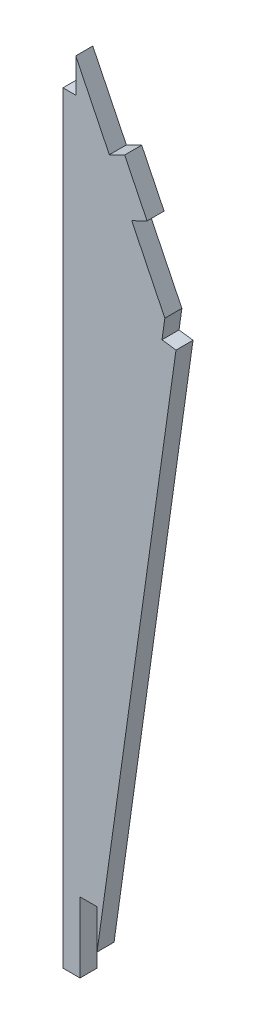
ISO-10303-21;
HEADER;
FILE_DESCRIPTION(('STEP AP214'),'2;1');
FILE_NAME('part.step','',(''),(''),'','','');
FILE_SCHEMA(('AUTOMOTIVE_DESIGN { 1 0 10303 214 1 1 1 1 }'));
ENDSEC;
DATA;
#1=APPLICATION_CONTEXT('core data for automotive mechanical design processes');
#2=APPLICATION_PROTOCOL_DEFINITION('international standard','automotive_design',2000,#1);
#3=PRODUCT_CONTEXT('',#1,'mechanical');
#4=PRODUCT('Part','Part','',(#3));
#5=PRODUCT_RELATED_PRODUCT_CATEGORY('part','',(#4));
#6=PRODUCT_DEFINITION_FORMATION('','',#4);
#7=PRODUCT_DEFINITION_CONTEXT('part definition',#1,'design');
#8=PRODUCT_DEFINITION('design','',#6,#7);
#9=PRODUCT_DEFINITION_SHAPE('','',#8);
#10=(LENGTH_UNIT() NAMED_UNIT(*) SI_UNIT(.MILLI.,.METRE.));
#11=(NAMED_UNIT(*) PLANE_ANGLE_UNIT() SI_UNIT($,.RADIAN.));
#12=(NAMED_UNIT(*) SI_UNIT($,.STERADIAN.) SOLID_ANGLE_UNIT());
#13=UNCERTAINTY_MEASURE_WITH_UNIT(LENGTH_MEASURE(1.E-05),#10,'distance_accuracy_value','');
#14=(GEOMETRIC_REPRESENTATION_CONTEXT(3) GLOBAL_UNCERTAINTY_ASSIGNED_CONTEXT((#13)) GLOBAL_UNIT_ASSIGNED_CONTEXT((#10,
#11,#12)) REPRESENTATION_CONTEXT('',''));
#15=CARTESIAN_POINT('',(0.,0.,0.));
#16=DIRECTION('',(0.,0.,1.));
#17=DIRECTION('',(1.,0.,0.));
#18=AXIS2_PLACEMENT_3D('',#15,#16,#17);
#19=CARTESIAN_POINT('',(6.49497415536462,96.8888019970677,2.));
#20=DIRECTION('',(-0.898794046299101,-0.438371146789213,0.));
#21=DIRECTION('',(0.438371146789213,-0.898794046299101,0.));
#22=AXIS2_PLACEMENT_3D('',#19,#20,#21);
#23=PLANE('',#22);
#24=DIRECTION('',(-0.438371146789213,0.898794046299101,0.));
#25=VECTOR('',#24,1.);
#26=CARTESIAN_POINT('',(6.49497415536462,96.8888019970677,0.));
#27=LINE('',#26,#25);
#28=CARTESIAN_POINT('',(10.4403144764674,88.7996555803761,0.));
#29=VERTEX_POINT('',#28);
#30=CARTESIAN_POINT('',(6.49497415536462,96.8888019970677,0.));
#31=VERTEX_POINT('',#30);
#32=EDGE_CURVE('E174',#29,#31,#27,.T.);
#33=ORIENTED_EDGE('',*,*,#32,.T.);
#34=DIRECTION('',(0.,0.,-1.));
#35=VECTOR('',#34,1.);
#36=CARTESIAN_POINT('',(6.49497415536462,96.8888019970677,2.));
#37=LINE('',#36,#35);
#38=CARTESIAN_POINT('',(6.49497415536462,96.8888019970677,2.));
#39=VERTEX_POINT('',#38);
#40=EDGE_CURVE('E11',#39,#31,#37,.T.);
#41=ORIENTED_EDGE('',*,*,#40,.F.);
#42=DIRECTION('',(-0.438371146789213,0.898794046299101,0.));
#43=VECTOR('',#42,1.);
#44=CARTESIAN_POINT('',(6.49497415536462,96.8888019970677,2.));
#45=LINE('',#44,#43);
#46=CARTESIAN_POINT('',(10.4403144764674,88.7996555803761,2.));
#47=VERTEX_POINT('',#46);
#48=EDGE_CURVE('E202',#47,#39,#45,.T.);
#49=ORIENTED_EDGE('',*,*,#48,.F.);
#50=DIRECTION('',(0.,0.,-1.));
#51=VECTOR('',#50,1.);
#52=CARTESIAN_POINT('',(10.4403144764674,88.7996555803761,2.));
#53=LINE('',#52,#51);
#54=EDGE_CURVE('E170',#47,#29,#53,.T.);
#55=ORIENTED_EDGE('',*,*,#54,.T.);
#56=EDGE_LOOP('',(#33,#41,#49,#55));
#57=FACE_BOUND('',#56,.T.);
#58=ADVANCED_FACE('F36',(#57),#23,.F.);
#59=CARTESIAN_POINT('',(6.49497415536462,96.8888019970677,2.));
#60=DIRECTION('',(1.,0.,0.));
#61=DIRECTION('',(0.,0.,-1.));
#62=AXIS2_PLACEMENT_3D('',#59,#60,#61);
#63=PLANE('',#62);
#64=DIRECTION('',(0.,-1.,0.));
#65=VECTOR('',#64,1.);
#66=CARTESIAN_POINT('',(6.49497415536462,96.8888019970677,0.));
#67=LINE('',#66,#65);
#68=CARTESIAN_POINT('',(6.49497415536462,92.8888019970695,0.));
#69=VERTEX_POINT('',#68);
#70=EDGE_CURVE('E177',#31,#69,#67,.T.);
#71=ORIENTED_EDGE('',*,*,#70,.T.);
#72=DIRECTION('',(0.,0.,-1.));
#73=VECTOR('',#72,1.);
#74=CARTESIAN_POINT('',(6.49497415536462,92.8888019970695,2.));
#75=LINE('',#74,#73);
#76=CARTESIAN_POINT('',(6.49497415536462,92.8888019970695,2.));
#77=VERTEX_POINT('',#76);
#78=EDGE_CURVE('E44',#77,#69,#75,.T.);
#79=ORIENTED_EDGE('',*,*,#78,.F.);
#80=DIRECTION('',(0.,-1.,0.));
#81=VECTOR('',#80,1.);
#82=CARTESIAN_POINT('',(6.49497415536462,96.8888019970677,2.));
#83=LINE('',#82,#81);
#84=EDGE_CURVE('E116',#39,#77,#83,.T.);
#85=ORIENTED_EDGE('',*,*,#84,.F.);
#86=ORIENTED_EDGE('',*,*,#40,.T.);
#87=EDGE_LOOP('',(#71,#79,#85,#86));
#88=FACE_BOUND('',#87,.T.);
#89=ADVANCED_FACE('F295',(#88),#63,.F.);
#90=CARTESIAN_POINT('',(6.49497415536462,92.8888019970695,2.));
#91=DIRECTION('',(0.,-1.,0.));
#92=DIRECTION('',(0.,0.,-1.));
#93=AXIS2_PLACEMENT_3D('',#90,#91,#92);
#94=PLANE('',#93);
#95=DIRECTION('',(-1.,0.,0.));
#96=VECTOR('',#95,1.);
#97=CARTESIAN_POINT('',(6.49497415536462,92.8888019970695,0.));
#98=LINE('',#97,#96);
#99=CARTESIAN_POINT('',(4.99497415536462,92.8888019970695,0.));
#100=VERTEX_POINT('',#99);
#101=EDGE_CURVE('E179',#69,#100,#98,.T.);
#102=ORIENTED_EDGE('',*,*,#101,.T.);
#103=DIRECTION('',(0.,0.,-1.));
#104=VECTOR('',#103,1.);
#105=CARTESIAN_POINT('',(4.99497415536462,92.8888019970695,2.));
#106=LINE('',#105,#104);
#107=CARTESIAN_POINT('',(4.99497415536462,92.8888019970695,2.));
#108=VERTEX_POINT('',#107);
#109=EDGE_CURVE('E230',#108,#100,#106,.T.);
#110=ORIENTED_EDGE('',*,*,#109,.F.);
#111=DIRECTION('',(-1.,0.,0.));
#112=VECTOR('',#111,1.);
#113=CARTESIAN_POINT('',(6.49497415536462,92.8888019970695,2.));
#114=LINE('',#113,#112);
#115=EDGE_CURVE('E238',#77,#108,#114,.T.);
#116=ORIENTED_EDGE('',*,*,#115,.F.);
#117=ORIENTED_EDGE('',*,*,#78,.T.);
#118=EDGE_LOOP('',(#102,#110,#116,#117));
#119=FACE_BOUND('',#118,.T.);
#120=ADVANCED_FACE('F236',(#119),#94,.F.);
#121=CARTESIAN_POINT('',(4.99497415536462,92.8888019970695,2.));
#122=DIRECTION('',(1.,0.,0.));
#123=DIRECTION('',(0.,0.,-1.));
#124=AXIS2_PLACEMENT_3D('',#121,#122,#123);
#125=PLANE('',#124);
#126=DIRECTION('',(0.,-1.,0.));
#127=VECTOR('',#126,1.);
#128=CARTESIAN_POINT('',(4.99497415536462,92.8888019970695,0.));
#129=LINE('',#128,#127);
#130=CARTESIAN_POINT('',(4.99497415536462,3.33954331851646,0.));
#131=VERTEX_POINT('',#130);
#132=EDGE_CURVE('E181',#100,#131,#129,.T.);
#133=ORIENTED_EDGE('',*,*,#132,.T.);
#134=DIRECTION('',(0.,0.,-1.));
#135=VECTOR('',#134,1.);
#136=CARTESIAN_POINT('',(4.99497415536462,3.33954331851646,2.));
#137=LINE('',#136,#135);
#138=CARTESIAN_POINT('',(4.99497415536462,3.33954331851646,2.));
#139=VERTEX_POINT('',#138);
#140=EDGE_CURVE('E227',#139,#131,#137,.T.);
#141=ORIENTED_EDGE('',*,*,#140,.F.);
#142=DIRECTION('',(0.,-1.,0.));
#143=VECTOR('',#142,1.);
#144=CARTESIAN_POINT('',(4.99497415536462,92.8888019970695,2.));
#145=LINE('',#144,#143);
#146=EDGE_CURVE('E256',#108,#139,#145,.T.);
#147=ORIENTED_EDGE('',*,*,#146,.F.);
#148=ORIENTED_EDGE('',*,*,#109,.T.);
#149=EDGE_LOOP('',(#133,#141,#147,#148));
#150=FACE_BOUND('',#149,.T.);
#151=ADVANCED_FACE('F247',(#150),#125,.F.);
#152=CARTESIAN_POINT('',(4.99497415536462,3.33954331851646,2.));
#153=DIRECTION('',(0.,1.,0.));
#154=DIRECTION('',(0.,0.,1.));
#155=AXIS2_PLACEMENT_3D('',#152,#153,#154);
#156=PLANE('',#155);
#157=DIRECTION('',(1.,0.,0.));
#158=VECTOR('',#157,1.);
#159=CARTESIAN_POINT('',(4.99497415536462,3.33954331851646,0.));
#160=LINE('',#159,#158);
#161=CARTESIAN_POINT('',(6.99497415536462,3.33954331851646,0.));
#162=VERTEX_POINT('',#161);
#163=EDGE_CURVE('E183',#131,#162,#160,.T.);
#164=ORIENTED_EDGE('',*,*,#163,.T.);
#165=DIRECTION('',(0.,0.,-1.));
#166=VECTOR('',#165,1.);
#167=CARTESIAN_POINT('',(6.99497415536462,3.33954331851646,2.));
#168=LINE('',#167,#166);
#169=CARTESIAN_POINT('',(6.99497415536462,3.33954331851646,2.));
#170=VERTEX_POINT('',#169);
#171=EDGE_CURVE('E224',#170,#162,#168,.T.);
#172=ORIENTED_EDGE('',*,*,#171,.F.);
#173=DIRECTION('',(1.,0.,0.));
#174=VECTOR('',#173,1.);
#175=CARTESIAN_POINT('',(4.99497415536462,3.33954331851646,2.));
#176=LINE('',#175,#174);
#177=EDGE_CURVE('E253',#139,#170,#176,.T.);
#178=ORIENTED_EDGE('',*,*,#177,.F.);
#179=ORIENTED_EDGE('',*,*,#140,.T.);
#180=EDGE_LOOP('',(#164,#172,#178,#179));
#181=FACE_BOUND('',#180,.T.);
#182=ADVANCED_FACE('F251',(#181),#156,.F.);
#183=CARTESIAN_POINT('',(6.99497415536462,3.33954331851646,2.));
#184=DIRECTION('',(-1.,0.,0.));
#185=DIRECTION('',(0.,0.,1.));
#186=AXIS2_PLACEMENT_3D('',#183,#184,#185);
#187=PLANE('',#186);
#188=DIRECTION('',(0.,1.,0.));
#189=VECTOR('',#188,1.);
#190=CARTESIAN_POINT('',(6.99497415536462,3.33954331851646,0.));
#191=LINE('',#190,#189);
#192=CARTESIAN_POINT('',(6.99497415536462,11.5895433185165,0.));
#193=VERTEX_POINT('',#192);
#194=EDGE_CURVE('E185',#162,#193,#191,.T.);
#195=ORIENTED_EDGE('',*,*,#194,.T.);
#196=DIRECTION('',(0.,0.,-1.));
#197=VECTOR('',#196,1.);
#198=CARTESIAN_POINT('',(6.99497415536462,11.5895433185165,2.));
#199=LINE('',#198,#197);
#200=CARTESIAN_POINT('',(6.99497415536462,11.5895433185165,2.));
#201=VERTEX_POINT('',#200);
#202=EDGE_CURVE('E221',#201,#193,#199,.T.);
#203=ORIENTED_EDGE('',*,*,#202,.F.);
#204=DIRECTION('',(0.,1.,0.));
#205=VECTOR('',#204,1.);
#206=CARTESIAN_POINT('',(6.99497415536462,3.33954331851646,2.));
#207=LINE('',#206,#205);
#208=EDGE_CURVE('E255',#170,#201,#207,.T.);
#209=ORIENTED_EDGE('',*,*,#208,.F.);
#210=ORIENTED_EDGE('',*,*,#171,.T.);
#211=EDGE_LOOP('',(#195,#203,#209,#210));
#212=FACE_BOUND('',#211,.T.);
#213=ADVANCED_FACE('F308',(#212),#187,.F.);
#214=CARTESIAN_POINT('',(6.99497415536462,11.5895433185165,2.));
#215=DIRECTION('',(0.,1.,0.));
#216=DIRECTION('',(0.,0.,1.));
#217=AXIS2_PLACEMENT_3D('',#214,#215,#216);
#218=PLANE('',#217);
#219=DIRECTION('',(1.,0.,0.));
#220=VECTOR('',#219,1.);
#221=CARTESIAN_POINT('',(6.99497415536462,11.5895433185165,0.));
#222=LINE('',#221,#220);
#223=CARTESIAN_POINT('',(8.99497415536462,11.5895433185165,0.));
#224=VERTEX_POINT('',#223);
#225=EDGE_CURVE('E187',#193,#224,#222,.T.);
#226=ORIENTED_EDGE('',*,*,#225,.T.);
#227=DIRECTION('',(0.,0.,-1.));
#228=VECTOR('',#227,1.);
#229=CARTESIAN_POINT('',(8.99497415536462,11.5895433185165,2.));
#230=LINE('',#229,#228);
#231=CARTESIAN_POINT('',(8.99497415536462,11.5895433185165,2.));
#232=VERTEX_POINT('',#231);
#233=EDGE_CURVE('E218',#232,#224,#230,.T.);
#234=ORIENTED_EDGE('',*,*,#233,.F.);
#235=DIRECTION('',(1.,0.,0.));
#236=VECTOR('',#235,1.);
#237=CARTESIAN_POINT('',(6.99497415536462,11.5895433185165,2.));
#238=LINE('',#237,#236);
#239=EDGE_CURVE('E258',#201,#232,#238,.T.);
#240=ORIENTED_EDGE('',*,*,#239,.F.);
#241=ORIENTED_EDGE('',*,*,#202,.T.);
#242=EDGE_LOOP('',(#226,#234,#240,#241));
#243=FACE_BOUND('',#242,.T.);
#244=ADVANCED_FACE('F311',(#243),#218,.F.);
#245=CARTESIAN_POINT('',(8.99497415536462,11.5895433185165,2.));
#246=DIRECTION('',(1.,0.,0.));
#247=DIRECTION('',(0.,0.,-1.));
#248=AXIS2_PLACEMENT_3D('',#245,#246,#247);
#249=PLANE('',#248);
#250=DIRECTION('',(0.,-1.,0.));
#251=VECTOR('',#250,1.);
#252=CARTESIAN_POINT('',(8.99497415536462,11.5895433185165,0.));
#253=LINE('',#252,#251);
#254=CARTESIAN_POINT('',(8.99497415536462,6.98119128124745,0.));
#255=VERTEX_POINT('',#254);
#256=EDGE_CURVE('E189',#224,#255,#253,.T.);
#257=ORIENTED_EDGE('',*,*,#256,.T.);
#258=DIRECTION('',(0.,0.,-1.));
#259=VECTOR('',#258,1.);
#260=CARTESIAN_POINT('',(8.99497415536462,6.98119128124745,2.));
#261=LINE('',#260,#259);
#262=CARTESIAN_POINT('',(8.99497415536462,6.98119128124745,2.));
#263=VERTEX_POINT('',#262);
#264=EDGE_CURVE('E215',#263,#255,#261,.T.);
#265=ORIENTED_EDGE('',*,*,#264,.F.);
#266=DIRECTION('',(0.,-1.,0.));
#267=VECTOR('',#266,1.);
#268=CARTESIAN_POINT('',(8.99497415536462,11.5895433185165,2.));
#269=LINE('',#268,#267);
#270=EDGE_CURVE('E264',#232,#263,#269,.T.);
#271=ORIENTED_EDGE('',*,*,#270,.F.);
#272=ORIENTED_EDGE('',*,*,#233,.T.);
#273=EDGE_LOOP('',(#257,#265,#271,#272));
#274=FACE_BOUND('',#273,.T.);
#275=ADVANCED_FACE('F315',(#274),#249,.F.);
#276=CARTESIAN_POINT('',(8.99497415536462,6.98119128124745,2.));
#277=DIRECTION('',(-0.990234220212163,0.139413733616201,0.));
#278=DIRECTION('',(-0.139413733616201,-0.990234220212163,0.));
#279=AXIS2_PLACEMENT_3D('',#276,#277,#278);
#280=PLANE('',#279);
#281=DIRECTION('',(0.139413733616201,0.990234220212163,0.));
#282=VECTOR('',#281,1.);
#283=CARTESIAN_POINT('',(8.99497415536462,6.98119128124745,0.));
#284=LINE('',#283,#282);
#285=CARTESIAN_POINT('',(18.2680249311152,72.8462389041174,0.));
#286=VERTEX_POINT('',#285);
#287=EDGE_CURVE('E191',#255,#286,#284,.T.);
#288=ORIENTED_EDGE('',*,*,#287,.T.);
#289=DIRECTION('',(0.,0.,-1.));
#290=VECTOR('',#289,1.);
#291=CARTESIAN_POINT('',(18.2680249311152,72.8462389041174,2.));
#292=LINE('',#291,#290);
#293=CARTESIAN_POINT('',(18.2680249311152,72.8462389041174,2.));
#294=VERTEX_POINT('',#293);
#295=EDGE_CURVE('E212',#294,#286,#292,.T.);
#296=ORIENTED_EDGE('',*,*,#295,.F.);
#297=DIRECTION('',(0.139413733616201,0.990234220212163,0.));
#298=VECTOR('',#297,1.);
#299=CARTESIAN_POINT('',(8.99497415536462,6.98119128124745,2.));
#300=LINE('',#299,#298);
#301=EDGE_CURVE('E266',#263,#294,#300,.T.);
#302=ORIENTED_EDGE('',*,*,#301,.F.);
#303=ORIENTED_EDGE('',*,*,#264,.T.);
#304=EDGE_LOOP('',(#288,#296,#302,#303));
#305=FACE_BOUND('',#304,.T.);
#306=ADVANCED_FACE('F319',(#305),#280,.F.);
#307=CARTESIAN_POINT('',(18.2680249311152,72.8462389041174,2.));
#308=DIRECTION('',(-0.139460770441598,-0.990227596821981,0.));
#309=DIRECTION('',(0.990227596821981,-0.139460770441598,0.));
#310=AXIS2_PLACEMENT_3D('',#307,#308,#309);
#311=PLANE('',#310);
#312=DIRECTION('',(-0.990227596821981,0.139460770441598,0.));
#313=VECTOR('',#312,1.);
#314=CARTESIAN_POINT('',(18.2680249311152,72.8462389041174,0.));
#315=LINE('',#314,#313);
#316=CARTESIAN_POINT('',(16.6264749529873,73.0774300215967,0.));
#317=VERTEX_POINT('',#316);
#318=EDGE_CURVE('E193',#286,#317,#315,.T.);
#319=ORIENTED_EDGE('',*,*,#318,.T.);
#320=DIRECTION('',(0.,0.,-1.));
#321=VECTOR('',#320,1.);
#322=CARTESIAN_POINT('',(16.6264749529873,73.0774300215967,2.));
#323=LINE('',#322,#321);
#324=CARTESIAN_POINT('',(16.6264749529873,73.0774300215967,2.));
#325=VERTEX_POINT('',#324);
#326=EDGE_CURVE('E209',#325,#317,#323,.T.);
#327=ORIENTED_EDGE('',*,*,#326,.F.);
#328=DIRECTION('',(-0.990227596821981,0.139460770441598,0.));
#329=VECTOR('',#328,1.);
#330=CARTESIAN_POINT('',(18.2680249311152,72.8462389041174,2.));
#331=LINE('',#330,#329);
#332=EDGE_CURVE('E268',#294,#325,#331,.T.);
#333=ORIENTED_EDGE('',*,*,#332,.F.);
#334=ORIENTED_EDGE('',*,*,#295,.T.);
#335=EDGE_LOOP('',(#319,#327,#333,#334));
#336=FACE_BOUND('',#335,.T.);
#337=ADVANCED_FACE('F323',(#336),#311,.F.);
#338=CARTESIAN_POINT('',(16.6264749529873,73.0774300215967,2.));
#339=DIRECTION('',(-0.990227596821985,0.139460770441573,0.));
#340=DIRECTION('',(-0.139460770441573,-0.990227596821985,0.));
#341=AXIS2_PLACEMENT_3D('',#338,#339,#340);
#342=PLANE('',#341);
#343=DIRECTION('',(0.139460770441573,0.990227596821984,0.));
#344=VECTOR('',#343,1.);
#345=CARTESIAN_POINT('',(16.6264749529873,73.0774300215967,0.));
#346=LINE('',#345,#344);
#347=CARTESIAN_POINT('',(16.958549535063,75.4352931994154,0.));
#348=VERTEX_POINT('',#347);
#349=EDGE_CURVE('E195',#317,#348,#346,.T.);
#350=ORIENTED_EDGE('',*,*,#349,.T.);
#351=DIRECTION('',(0.,0.,-1.));
#352=VECTOR('',#351,1.);
#353=CARTESIAN_POINT('',(16.958549535063,75.4352931994154,2.));
#354=LINE('',#353,#352);
#355=CARTESIAN_POINT('',(16.958549535063,75.4352931994154,2.));
#356=VERTEX_POINT('',#355);
#357=EDGE_CURVE('E206',#356,#348,#354,.T.);
#358=ORIENTED_EDGE('',*,*,#357,.F.);
#359=DIRECTION('',(0.139460770441573,0.990227596821984,0.));
#360=VECTOR('',#359,1.);
#361=CARTESIAN_POINT('',(16.6264749529873,73.0774300215967,2.));
#362=LINE('',#361,#360);
#363=EDGE_CURVE('E270',#325,#356,#362,.T.);
#364=ORIENTED_EDGE('',*,*,#363,.F.);
#365=ORIENTED_EDGE('',*,*,#326,.T.);
#366=EDGE_LOOP('',(#350,#358,#364,#365));
#367=FACE_BOUND('',#366,.T.);
#368=ADVANCED_FACE('F276',(#367),#342,.F.);
#369=CARTESIAN_POINT('',(13.0705413572023,83.4068913025808,2.));
#370=DIRECTION('',(-0.898794046299296,-0.438371146788813,0.));
#371=DIRECTION('',(0.438371146788813,-0.898794046299296,0.));
#372=AXIS2_PLACEMENT_3D('',#369,#370,#371);
#373=PLANE('',#372);
#374=DIRECTION('',(-0.438371146788813,0.898794046299296,0.));
#375=VECTOR('',#374,1.);
#376=CARTESIAN_POINT('',(13.0705413572023,83.4068913025808,0.));
#377=LINE('',#376,#375);
#378=CARTESIAN_POINT('',(13.0705413572023,83.4068913025808,0.));
#379=VERTEX_POINT('',#378);
#380=EDGE_CURVE('E197',#348,#379,#377,.T.);
#381=ORIENTED_EDGE('',*,*,#380,.T.);
#382=DIRECTION('',(0.,0.,-1.));
#383=VECTOR('',#382,1.);
#384=CARTESIAN_POINT('',(13.0705413572023,83.4068913025808,2.));
#385=LINE('',#384,#383);
#386=CARTESIAN_POINT('',(13.0705413572023,83.4068913025808,2.));
#387=VERTEX_POINT('',#386);
#388=EDGE_CURVE('E165',#387,#379,#385,.T.);
#389=ORIENTED_EDGE('',*,*,#388,.F.);
#390=DIRECTION('',(-0.438371146788813,0.898794046299296,0.));
#391=VECTOR('',#390,1.);
#392=CARTESIAN_POINT('',(13.0705413572023,83.4068913025808,2.));
#393=LINE('',#392,#391);
#394=EDGE_CURVE('E156',#356,#387,#393,.T.);
#395=ORIENTED_EDGE('',*,*,#394,.F.);
#396=ORIENTED_EDGE('',*,*,#357,.T.);
#397=EDGE_LOOP('',(#381,#389,#395,#396));
#398=FACE_BOUND('',#397,.T.);
#399=ADVANCED_FACE('F280',(#398),#373,.F.);
#400=CARTESIAN_POINT('',(14.868129449801,84.2836335961588,2.));
#401=DIRECTION('',(-0.438371146788932,0.898794046299238,0.));
#402=DIRECTION('',(-0.898794046299238,-0.438371146788932,0.));
#403=AXIS2_PLACEMENT_3D('',#400,#401,#402);
#404=PLANE('',#403);
#405=DIRECTION('',(0.898794046299238,0.438371146788932,0.));
#406=VECTOR('',#405,1.);
#407=CARTESIAN_POINT('',(14.868129449801,84.2836335961588,0.));
#408=LINE('',#407,#406);
#409=CARTESIAN_POINT('',(14.868129449801,84.2836335961588,0.));
#410=VERTEX_POINT('',#409);
#411=EDGE_CURVE('E164',#379,#410,#408,.T.);
#412=ORIENTED_EDGE('',*,*,#411,.T.);
#413=DIRECTION('',(0.,0.,-1.));
#414=VECTOR('',#413,1.);
#415=CARTESIAN_POINT('',(14.868129449801,84.2836335961588,2.));
#416=LINE('',#415,#414);
#417=CARTESIAN_POINT('',(14.868129449801,84.2836335961588,2.));
#418=VERTEX_POINT('',#417);
#419=EDGE_CURVE('E161',#418,#410,#416,.T.);
#420=ORIENTED_EDGE('',*,*,#419,.F.);
#421=DIRECTION('',(0.898794046299238,0.438371146788932,0.));
#422=VECTOR('',#421,1.);
#423=CARTESIAN_POINT('',(14.868129449801,84.2836335961588,2.));
#424=LINE('',#423,#422);
#425=EDGE_CURVE('E150',#387,#418,#424,.T.);
#426=ORIENTED_EDGE('',*,*,#425,.F.);
#427=ORIENTED_EDGE('',*,*,#388,.T.);
#428=EDGE_LOOP('',(#412,#420,#426,#427));
#429=FACE_BOUND('',#428,.T.);
#430=ADVANCED_FACE('F162',(#429),#404,.F.);
#431=CARTESIAN_POINT('',(12.2379025690634,89.6763978739527,2.));
#432=DIRECTION('',(-0.898794046298927,-0.43837114678957,0.));
#433=DIRECTION('',(0.43837114678957,-0.898794046298927,0.));
#434=AXIS2_PLACEMENT_3D('',#431,#432,#433);
#435=PLANE('',#434);
#436=DIRECTION('',(-0.43837114678957,0.898794046298927,0.));
#437=VECTOR('',#436,1.);
#438=CARTESIAN_POINT('',(12.2379025690634,89.6763978739527,0.));
#439=LINE('',#438,#437);
#440=CARTESIAN_POINT('',(12.2379025690634,89.6763978739527,0.));
#441=VERTEX_POINT('',#440);
#442=EDGE_CURVE('E102',#410,#441,#439,.T.);
#443=ORIENTED_EDGE('',*,*,#442,.T.);
#444=DIRECTION('',(0.,0.,-1.));
#445=VECTOR('',#444,1.);
#446=CARTESIAN_POINT('',(12.2379025690634,89.6763978739527,2.));
#447=LINE('',#446,#445);
#448=CARTESIAN_POINT('',(12.2379025690634,89.6763978739527,2.));
#449=VERTEX_POINT('',#448);
#450=EDGE_CURVE('E166',#449,#441,#447,.T.);
#451=ORIENTED_EDGE('',*,*,#450,.F.);
#452=DIRECTION('',(-0.43837114678957,0.898794046298927,0.));
#453=VECTOR('',#452,1.);
#454=CARTESIAN_POINT('',(12.2379025690634,89.6763978739527,2.));
#455=LINE('',#454,#453);
#456=EDGE_CURVE('E154',#418,#449,#455,.T.);
#457=ORIENTED_EDGE('',*,*,#456,.F.);
#458=ORIENTED_EDGE('',*,*,#419,.T.);
#459=EDGE_LOOP('',(#443,#451,#457,#458));
#460=FACE_BOUND('',#459,.T.);
#461=ADVANCED_FACE('F168',(#460),#435,.F.);
#462=CARTESIAN_POINT('',(10.4403144764674,88.7996555803761,2.));
#463=DIRECTION('',(0.438371146788915,-0.898794046299246,0.));
#464=DIRECTION('',(0.898794046299246,0.438371146788915,0.));
#465=AXIS2_PLACEMENT_3D('',#462,#463,#464);
#466=PLANE('',#465);
#467=DIRECTION('',(-0.898794046299246,-0.438371146788915,0.));
#468=VECTOR('',#467,1.);
#469=CARTESIAN_POINT('',(10.4403144764674,88.7996555803761,0.));
#470=LINE('',#469,#468);
#471=EDGE_CURVE('E108',#441,#29,#470,.T.);
#472=ORIENTED_EDGE('',*,*,#471,.T.);
#473=ORIENTED_EDGE('',*,*,#54,.F.);
#474=DIRECTION('',(-0.898794046299246,-0.438371146788915,0.));
#475=VECTOR('',#474,1.);
#476=CARTESIAN_POINT('',(10.4403144764674,88.7996555803761,2.));
#477=LINE('',#476,#475);
#478=EDGE_CURVE('E52',#449,#47,#477,.T.);
#479=ORIENTED_EDGE('',*,*,#478,.F.);
#480=ORIENTED_EDGE('',*,*,#450,.T.);
#481=EDGE_LOOP('',(#472,#473,#479,#480));
#482=FACE_BOUND('',#481,.T.);
#483=ADVANCED_FACE('F284',(#482),#466,.F.);
#484=CARTESIAN_POINT('',(0.,0.,2.));
#485=DIRECTION('',(0.,0.,1.));
#486=DIRECTION('',(1.,0.,0.));
#487=AXIS2_PLACEMENT_3D('',#484,#485,#486);
#488=PLANE('',#487);
#489=ORIENTED_EDGE('',*,*,#48,.T.);
#490=ORIENTED_EDGE('',*,*,#84,.T.);
#491=ORIENTED_EDGE('',*,*,#115,.T.);
#492=ORIENTED_EDGE('',*,*,#146,.T.);
#493=ORIENTED_EDGE('',*,*,#177,.T.);
#494=ORIENTED_EDGE('',*,*,#208,.T.);
#495=ORIENTED_EDGE('',*,*,#239,.T.);
#496=ORIENTED_EDGE('',*,*,#270,.T.);
#497=ORIENTED_EDGE('',*,*,#301,.T.);
#498=ORIENTED_EDGE('',*,*,#332,.T.);
#499=ORIENTED_EDGE('',*,*,#363,.T.);
#500=ORIENTED_EDGE('',*,*,#394,.T.);
#501=ORIENTED_EDGE('',*,*,#425,.T.);
#502=ORIENTED_EDGE('',*,*,#456,.T.);
#503=ORIENTED_EDGE('',*,*,#478,.T.);
#504=EDGE_LOOP('',(#489,#490,#491,#492,#493,#494,#495,#496,#497,#498,#499,#500,#501,#502,#503));
#505=FACE_BOUND('',#504,.T.);
#506=ADVANCED_FACE('F152',(#505),#488,.T.);
#507=CARTESIAN_POINT('',(0.,0.,0.));
#508=DIRECTION('',(0.,0.,1.));
#509=DIRECTION('',(1.,0.,0.));
#510=AXIS2_PLACEMENT_3D('',#507,#508,#509);
#511=PLANE('',#510);
#512=ORIENTED_EDGE('',*,*,#32,.F.);
#513=ORIENTED_EDGE('',*,*,#471,.F.);
#514=ORIENTED_EDGE('',*,*,#442,.F.);
#515=ORIENTED_EDGE('',*,*,#411,.F.);
#516=ORIENTED_EDGE('',*,*,#380,.F.);
#517=ORIENTED_EDGE('',*,*,#349,.F.);
#518=ORIENTED_EDGE('',*,*,#318,.F.);
#519=ORIENTED_EDGE('',*,*,#287,.F.);
#520=ORIENTED_EDGE('',*,*,#256,.F.);
#521=ORIENTED_EDGE('',*,*,#225,.F.);
#522=ORIENTED_EDGE('',*,*,#194,.F.);
#523=ORIENTED_EDGE('',*,*,#163,.F.);
#524=ORIENTED_EDGE('',*,*,#132,.F.);
#525=ORIENTED_EDGE('',*,*,#101,.F.);
#526=ORIENTED_EDGE('',*,*,#70,.F.);
#527=EDGE_LOOP('',(#512,#513,#514,#515,#516,#517,#518,#519,#520,#521,#522,#523,#524,#525,#526));
#528=FACE_BOUND('',#527,.T.);
#529=ADVANCED_FACE('F242',(#528),#511,.F.);
#530=CLOSED_SHELL('',(#58,#89,#120,#151,#182,#213,#244,#275,#306,#337,#368,#399,#430,#461,#483,
#506,#529));
#531=MANIFOLD_SOLID_BREP('B2',#530);
#532=ADVANCED_BREP_SHAPE_REPRESENTATION('',(#18,#531),#14);
#533=SHAPE_DEFINITION_REPRESENTATION(#9,#532);
ENDSEC;
END-ISO-10303-21;
